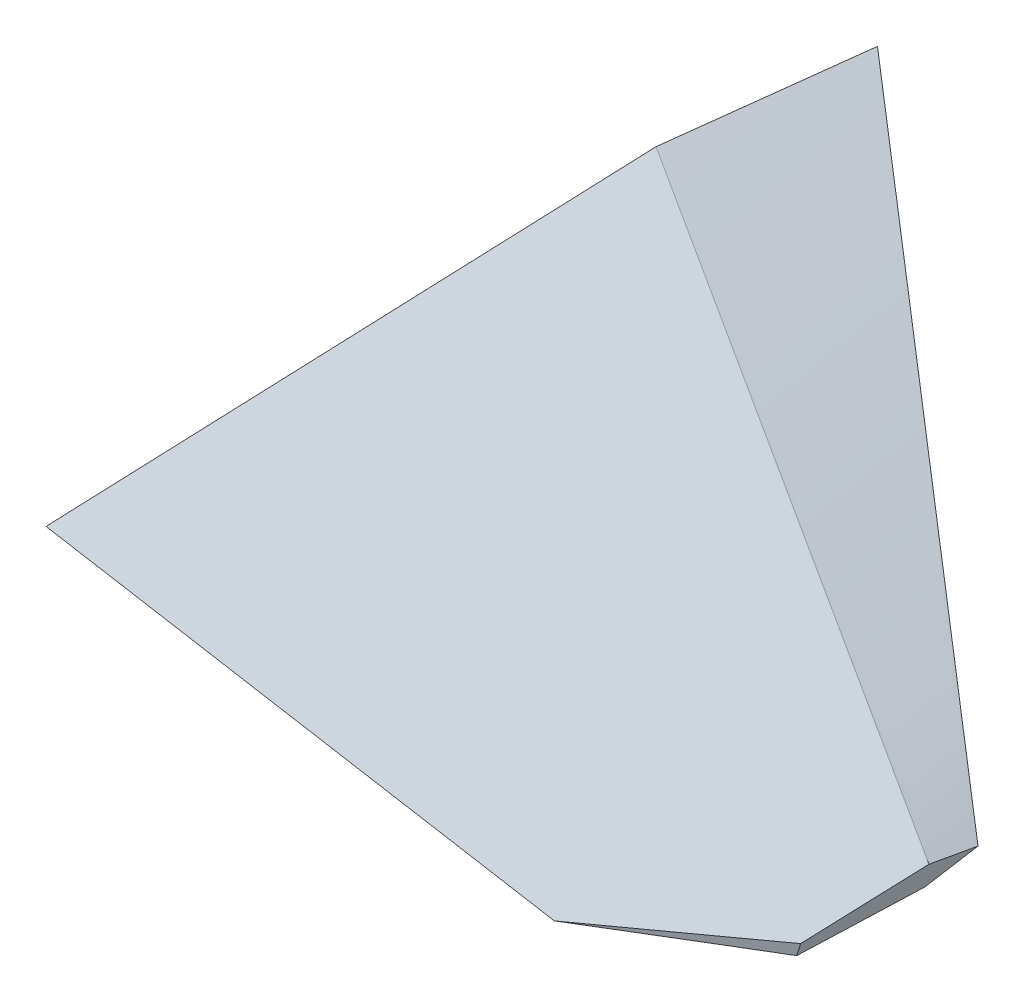
ISO-10303-21;
HEADER;
FILE_DESCRIPTION(('STEP AP214'),'2;1');
FILE_NAME('part.step','',(''),(''),'','','');
FILE_SCHEMA(('AUTOMOTIVE_DESIGN { 1 0 10303 214 1 1 1 1 }'));
ENDSEC;
DATA;
#1=APPLICATION_CONTEXT('core data for automotive mechanical design processes');
#2=APPLICATION_PROTOCOL_DEFINITION('international standard','automotive_design',2000,#1);
#3=PRODUCT_CONTEXT('',#1,'mechanical');
#4=PRODUCT('Part','Part','',(#3));
#5=PRODUCT_RELATED_PRODUCT_CATEGORY('part','',(#4));
#6=PRODUCT_DEFINITION_FORMATION('','',#4);
#7=PRODUCT_DEFINITION_CONTEXT('part definition',#1,'design');
#8=PRODUCT_DEFINITION('design','',#6,#7);
#9=PRODUCT_DEFINITION_SHAPE('','',#8);
#10=(LENGTH_UNIT() NAMED_UNIT(*) SI_UNIT(.MILLI.,.METRE.));
#11=(NAMED_UNIT(*) PLANE_ANGLE_UNIT() SI_UNIT($,.RADIAN.));
#12=(NAMED_UNIT(*) SI_UNIT($,.STERADIAN.) SOLID_ANGLE_UNIT());
#13=UNCERTAINTY_MEASURE_WITH_UNIT(LENGTH_MEASURE(1.E-05),#10,'distance_accuracy_value','');
#14=(GEOMETRIC_REPRESENTATION_CONTEXT(3) GLOBAL_UNCERTAINTY_ASSIGNED_CONTEXT((#13)) GLOBAL_UNIT_ASSIGNED_CONTEXT((#10,
#11,#12)) REPRESENTATION_CONTEXT('',''));
#15=CARTESIAN_POINT('',(0.,0.,0.));
#16=DIRECTION('',(0.,0.,1.));
#17=DIRECTION('',(1.,0.,0.));
#18=AXIS2_PLACEMENT_3D('',#15,#16,#17);
#19=CARTESIAN_POINT('',(2264.,0.,7652.5));
#20=DIRECTION('',(-0.697531016860244,0.,-0.716554590047342));
#21=DIRECTION('',(0.716554590047342,0.,-0.697531016860244));
#22=AXIS2_PLACEMENT_3D('',#19,#20,#21);
#23=PLANE('',#22);
#24=DIRECTION('',(-0.181855240179557,-0.967259031099984,0.177027224953551));
#25=VECTOR('',#24,1.);
#26=CARTESIAN_POINT('',(2777.18459449673,786.986197849038,7152.93977526867));
#27=LINE('',#26,#25);
#28=CARTESIAN_POINT('',(2917.91105544952,1535.48780900373,7015.94941504916));
#29=VERTEX_POINT('',#28);
#30=CARTESIAN_POINT('',(2912.13388329117,1504.75995129195,7021.57321095549));
#31=VERTEX_POINT('',#30);
#32=EDGE_CURVE('E211',#29,#31,#27,.T.);
#33=ORIENTED_EDGE('',*,*,#32,.F.);
#34=CARTESIAN_POINT('',(2551.68799055691,1588.30646313811,7372.44974370566));
#35=CARTESIAN_POINT('',(2561.85908933415,1586.81545891525,7362.5486740995));
#36=CARTESIAN_POINT('',(2572.03030381676,1585.32599148495,7352.64749185979));
#37=CARTESIAN_POINT('',(2592.37297369507,1582.35032101549,7332.8448928632));
#38=CARTESIAN_POINT('',(2602.54442909067,1580.86411797496,7322.94347610643));
#39=CARTESIAN_POINT('',(2622.88759502421,1577.89516639539,7303.14039422422));
#40=CARTESIAN_POINT('',(2633.05930556207,1576.41241785509,7293.23872909888));
#41=CARTESIAN_POINT('',(2653.40299741478,1573.45058449897,7273.43513525995));
#42=CARTESIAN_POINT('',(2663.57497872956,1571.97149968204,7263.53320654645));
#43=CARTESIAN_POINT('',(2683.91922896556,1569.01721889018,7243.72906914857));
#44=CARTESIAN_POINT('',(2694.09149788671,1567.54202291435,7233.82686046426));
#45=CARTESIAN_POINT('',(2714.43634157628,1564.59576382112,7214.02214536823));
#46=CARTESIAN_POINT('',(2724.60891634464,1563.12470070312,7204.11963895654));
#47=CARTESIAN_POINT('',(2744.95439375768,1560.18697149333,7184.31430696155));
#48=CARTESIAN_POINT('',(2755.1272964024,1558.72030540233,7174.41148137819));
#49=CARTESIAN_POINT('',(2775.47344849196,1555.79165792881,7154.60549261845));
#50=CARTESIAN_POINT('',(2785.64669793681,1554.32967654654,7144.70232944205));
#51=CARTESIAN_POINT('',(2805.99356655332,1551.41071086214,7124.89564317818));
#52=CARTESIAN_POINT('',(2816.16718572505,1549.9537265608,7114.99212009066));
#53=CARTESIAN_POINT('',(2836.51481882396,1547.04509614959,7095.18468964039));
#54=CARTESIAN_POINT('',(2846.68883275126,1545.59345004123,7085.28078227754));
#55=CARTESIAN_POINT('',(2867.03728250197,1542.69586548015,7065.47255685649));
#56=CARTESIAN_POINT('',(2877.21171832558,1541.24992702993,7055.56823879811));
#57=CARTESIAN_POINT('',(2897.56104221048,1538.36417238011,7035.75916244998));
#58=CARTESIAN_POINT('',(2907.73593027205,1536.92435618436,7025.85440415995));
#59=CARTESIAN_POINT('',(2917.91105544952,1535.48780900373,7015.94941504914));
#60=B_SPLINE_CURVE_WITH_KNOTS('',3,(#34,#35,#36,#37,#38,#39,#40,#41,#42,#43,#44,#45,#46,#47,#48,
#49,#50,#51,#52,#53,#54,#55,#56,#57,#58,#59),.UNSPECIFIED.,.F.,.F.,(4,2,2,2,2,2,2,2,2,2,2,2,4),
(0.,42.8176331472219,85.6352485668465,128.452848431335,171.270435344161,214.088012415988,
256.905583355069,299.723162072028,342.54074306137,385.358330773943,428.175930671245,
470.993549428293,513.81119517947),.UNSPECIFIED.);
#61=CARTESIAN_POINT('',(2551.68799055691,1588.30646313811,7372.44974370566));
#62=VERTEX_POINT('',#61);
#63=EDGE_CURVE('E50',#62,#29,#60,.T.);
#64=ORIENTED_EDGE('',*,*,#63,.F.);
#65=CARTESIAN_POINT('',(2912.13388329117,1504.75995129195,7021.5732109555));
#66=CARTESIAN_POINT('',(2902.12505219001,1507.11050301799,7031.31632087699));
#67=CARTESIAN_POINT('',(2892.11583480539,1509.45785003662,7041.05980682661));
#68=CARTESIAN_POINT('',(2872.09668602345,1514.14655406342,7060.54747378248));
#69=CARTESIAN_POINT('',(2862.08675462657,1516.48791107528,7070.29165478829));
#70=CARTESIAN_POINT('',(2842.0662283264,1521.16505638709,7089.78066269111));
#71=CARTESIAN_POINT('',(2832.0556334234,1523.50084468943,7099.52548958784));
#72=CARTESIAN_POINT('',(2812.03382465856,1528.16722504834,7119.0157459076));
#73=CARTESIAN_POINT('',(2802.0226107969,1530.49781710633,7128.76117533046));
#74=CARTESIAN_POINT('',(2781.99960507437,1535.15414719082,7148.25259683026));
#75=CARTESIAN_POINT('',(2771.98781321359,1537.47988521806,7157.99858890712));
#76=CARTESIAN_POINT('',(2751.96368880111,1542.12681900675,7177.49109939715));
#77=CARTESIAN_POINT('',(2741.95135624944,1544.44801476844,7187.23761781028));
#78=CARTESIAN_POINT('',(2721.92618674402,1549.08614906913,7206.73114564742));
#79=CARTESIAN_POINT('',(2711.91334979036,1551.40308760891,7216.47815507133));
#80=CARTESIAN_POINT('',(2691.8872002493,1556.03296983426,7235.97263692547));
#81=CARTESIAN_POINT('',(2681.87388766183,1558.34591351929,7245.72010935575));
#82=CARTESIAN_POINT('',(2661.84681532834,1562.96804671853,7265.21548950339));
#83=CARTESIAN_POINT('',(2651.83305558223,1565.2772362319,7274.96339722084));
#84=CARTESIAN_POINT('',(2631.80511511008,1569.89208237054,7294.45962245921));
#85=CARTESIAN_POINT('',(2621.79093438393,1572.19773899477,7304.20793998025));
#86=CARTESIAN_POINT('',(2601.76217621634,1576.80572440556,7323.70496120533));
#87=CARTESIAN_POINT('',(2591.74759877477,1579.10805319095,7333.45366490952));
#88=CARTESIAN_POINT('',(2571.71806912773,1583.70956861293,7352.9514371323));
#89=CARTESIAN_POINT('',(2561.70311692212,1586.00875524826,7362.70050565103));
#90=CARTESIAN_POINT('',(2551.68799055691,1588.30646313811,7372.44974370566));
#91=B_SPLINE_CURVE_WITH_KNOTS('',3,(#65,#66,#67,#68,#69,#70,#71,#72,#73,#74,#75,#76,#77,#78,#79,
#80,#81,#82,#83,#84,#85,#86,#87,#88,#89,#90),.UNSPECIFIED.,.F.,.F.,(4,2,2,2,2,2,2,2,2,2,2,2,4),
(0.,42.4931735957222,84.9863210033463,127.4794502047,169.972567701935,212.465678779138,
254.958787715266,297.451888973896,339.944996179659,382.438112883539,424.931242053921,
467.424386167427,509.917547284836),.UNSPECIFIED.);
#92=EDGE_CURVE('E11',#31,#62,#91,.T.);
#93=ORIENTED_EDGE('',*,*,#92,.F.);
#94=EDGE_LOOP('',(#33,#64,#93));
#95=FACE_BOUND('',#94,.T.);
#96=ADVANCED_FACE('F41',(#95),#23,.F.);
#97=CARTESIAN_POINT('',(2539.45761462919,-477.445709562425,-7.03929742032787E-13));
#98=DIRECTION('',(0.982781120457582,-0.184773562156871,0.));
#99=DIRECTION('',(0.184773562156871,0.982781120457582,0.));
#100=AXIS2_PLACEMENT_3D('',#97,#98,#99);
#101=PLANE('',#100);
#102=ORIENTED_EDGE('',*,*,#32,.T.);
#103=CARTESIAN_POINT('',(2908.99403778226,1488.05961358513,6642.5));
#104=CARTESIAN_POINT('',(2909.99489457728,1493.38301132094,6763.33333333332));
#105=CARTESIAN_POINT('',(2910.99575137229,1498.70640905675,6884.16666666665));
#106=CARTESIAN_POINT('',(2912.99746496233,1509.35320452838,7125.83333333332));
#107=CARTESIAN_POINT('',(2913.99832175734,1514.67660226419,7246.66666666666));
#108=CARTESIAN_POINT('',(2914.99917855236,1520.,7367.5));
#109=B_SPLINE_CURVE_WITH_KNOTS('',3,(#103,#104,#105,#106,#107,#108),.UNSPECIFIED.,.F.,.F.,(4,2,
4),(0.,0.5,1.),.UNSPECIFIED.);
#110=CARTESIAN_POINT('',(2908.99403778226,1488.05961358513,6642.5));
#111=VERTEX_POINT('',#110);
#112=EDGE_CURVE('E63',#111,#31,#109,.T.);
#113=ORIENTED_EDGE('',*,*,#112,.F.);
#114=CARTESIAN_POINT('',(2914.99917855236,1520.,6492.5));
#115=CARTESIAN_POINT('',(2913.99832175734,1514.67660226419,6517.5));
#116=CARTESIAN_POINT('',(2912.99746496233,1509.35320452838,6542.5));
#117=CARTESIAN_POINT('',(2910.99575137229,1498.70640905675,6592.5));
#118=CARTESIAN_POINT('',(2909.99489457728,1493.38301132094,6617.5));
#119=CARTESIAN_POINT('',(2908.99403778226,1488.05961358513,6642.5));
#120=B_SPLINE_CURVE_WITH_KNOTS('',3,(#114,#115,#116,#117,#118,#119),.UNSPECIFIED.,.F.,.F.,(4,2,
4),(0.,0.5,1.),.UNSPECIFIED.);
#121=CARTESIAN_POINT('',(2914.99917855236,1520.,6492.5));
#122=VERTEX_POINT('',#121);
#123=EDGE_CURVE('E216',#122,#111,#120,.T.);
#124=ORIENTED_EDGE('',*,*,#123,.F.);
#125=CARTESIAN_POINT('',(2921.00431932246,1551.94038641487,6642.5));
#126=CARTESIAN_POINT('',(2920.00346252744,1546.61698867906,6617.49999999999));
#127=CARTESIAN_POINT('',(2919.00260573242,1541.29359094325,6592.49999999999));
#128=CARTESIAN_POINT('',(2917.00089214239,1530.64679547162,6542.49999999999));
#129=CARTESIAN_POINT('',(2916.00003534738,1525.32339773581,6517.49999999999));
#130=CARTESIAN_POINT('',(2914.99917855236,1520.,6492.5));
#131=B_SPLINE_CURVE_WITH_KNOTS('',3,(#125,#126,#127,#128,#129,#130),.UNSPECIFIED.,.F.,.F.,(4,2,
4),(0.,0.5,1.),.UNSPECIFIED.);
#132=CARTESIAN_POINT('',(2921.00431932246,1551.94038641487,6642.5));
#133=VERTEX_POINT('',#132);
#134=EDGE_CURVE('E97',#133,#122,#131,.T.);
#135=ORIENTED_EDGE('',*,*,#134,.F.);
#136=CARTESIAN_POINT('',(2914.99917855236,1520.,7367.5));
#137=CARTESIAN_POINT('',(2916.00003534738,1525.32339773581,7246.66666666669));
#138=CARTESIAN_POINT('',(2917.00089214239,1530.64679547162,7125.83333333337));
#139=CARTESIAN_POINT('',(2919.00260573242,1541.29359094325,6884.16666666671));
#140=CARTESIAN_POINT('',(2920.00346252744,1546.61698867906,6763.33333333336));
#141=CARTESIAN_POINT('',(2921.00431932246,1551.94038641487,6642.5));
#142=B_SPLINE_CURVE_WITH_KNOTS('',3,(#136,#137,#138,#139,#140,#141),.UNSPECIFIED.,.F.,.F.,(4,2,
4),(0.,0.5,1.),.UNSPECIFIED.);
#143=EDGE_CURVE('E215',#29,#133,#142,.T.);
#144=ORIENTED_EDGE('',*,*,#143,.F.);
#145=EDGE_LOOP('',(#102,#113,#124,#135,#144));
#146=FACE_BOUND('',#145,.T.);
#147=ADVANCED_FACE('F144',(#146),#101,.T.);
#148=CARTESIAN_POINT('',(1079.99917855236,0.,0.));
#149=DIRECTION('',(1.,0.,0.));
#150=DIRECTION('',(0.,0.,1.));
#151=AXIS2_PLACEMENT_3D('',#148,#149,#150);
#152=PLANE('',#151);
#153=CARTESIAN_POINT('',(1079.99917855236,1795.,5602.5));
#154=CARTESIAN_POINT('',(1079.99917855236,1806.66666666667,5494.16666666666));
#155=CARTESIAN_POINT('',(1079.99917855236,1818.33333333333,5385.83333333332));
#156=CARTESIAN_POINT('',(1079.99917855236,1841.66666666667,5169.16666666665));
#157=CARTESIAN_POINT('',(1079.99917855236,1853.33333333333,5060.83333333332));
#158=CARTESIAN_POINT('',(1079.99917855236,1865.,4952.5));
#159=B_SPLINE_CURVE_WITH_KNOTS('',3,(#153,#154,#155,#156,#157,#158),.UNSPECIFIED.,.F.,.F.,(4,2,
4),(0.,0.5,1.),.UNSPECIFIED.);
#160=CARTESIAN_POINT('',(1079.99917855236,1865.,4952.5));
#161=VERTEX_POINT('',#160);
#162=CARTESIAN_POINT('',(1079.99917855236,1795.,5602.5));
#163=VERTEX_POINT('',#162);
#164=EDGE_CURVE('E111',#161,#163,#159,.F.);
#165=ORIENTED_EDGE('',*,*,#164,.T.);
#166=CARTESIAN_POINT('',(1079.99917855236,1865.,7392.5));
#167=CARTESIAN_POINT('',(1079.99917855236,1853.33333333333,7094.16666666666));
#168=CARTESIAN_POINT('',(1079.99917855236,1841.66666666667,6795.83333333332));
#169=CARTESIAN_POINT('',(1079.99917855236,1818.33333333333,6199.16666666666));
#170=CARTESIAN_POINT('',(1079.99917855236,1806.66666666667,5900.83333333333));
#171=CARTESIAN_POINT('',(1079.99917855236,1795.,5602.5));
#172=B_SPLINE_CURVE_WITH_KNOTS('',3,(#166,#167,#168,#169,#170,#171),.UNSPECIFIED.,.F.,.F.,(4,2,
4),(0.,0.5,1.),.UNSPECIFIED.);
#173=CARTESIAN_POINT('',(1079.99917855236,1865.,7392.5));
#174=VERTEX_POINT('',#173);
#175=EDGE_CURVE('E120',#163,#174,#172,.F.);
#176=ORIENTED_EDGE('',*,*,#175,.T.);
#177=CARTESIAN_POINT('',(1079.99917855236,1935.,5602.5));
#178=CARTESIAN_POINT('',(1079.99917855236,1923.33333333333,5900.83333333334));
#179=CARTESIAN_POINT('',(1079.99917855236,1911.66666666667,6199.16666666667));
#180=CARTESIAN_POINT('',(1079.99917855236,1888.33333333333,6795.83333333334));
#181=CARTESIAN_POINT('',(1079.99917855236,1876.66666666667,7094.16666666667));
#182=CARTESIAN_POINT('',(1079.99917855236,1865.,7392.5));
#183=B_SPLINE_CURVE_WITH_KNOTS('',3,(#177,#178,#179,#180,#181,#182),.UNSPECIFIED.,.F.,.F.,(4,2,
4),(0.,0.5,1.),.UNSPECIFIED.);
#184=CARTESIAN_POINT('',(1079.99917855236,1935.,5602.5));
#185=VERTEX_POINT('',#184);
#186=EDGE_CURVE('E113',#174,#185,#183,.F.);
#187=ORIENTED_EDGE('',*,*,#186,.T.);
#188=CARTESIAN_POINT('',(1079.99917855236,1865.,4952.5));
#189=CARTESIAN_POINT('',(1079.99917855236,1876.66666666667,5060.83333333333));
#190=CARTESIAN_POINT('',(1079.99917855236,1888.33333333333,5169.16666666666));
#191=CARTESIAN_POINT('',(1079.99917855236,1911.66666666667,5385.83333333333));
#192=CARTESIAN_POINT('',(1079.99917855236,1923.33333333333,5494.16666666666));
#193=CARTESIAN_POINT('',(1079.99917855236,1935.,5602.5));
#194=B_SPLINE_CURVE_WITH_KNOTS('',3,(#188,#189,#190,#191,#192,#193),.UNSPECIFIED.,.F.,.F.,(4,2,
4),(0.,0.5,1.),.UNSPECIFIED.);
#195=EDGE_CURVE('E93',#185,#161,#194,.F.);
#196=ORIENTED_EDGE('',*,*,#195,.T.);
#197=EDGE_LOOP('',(#165,#176,#187,#196));
#198=FACE_BOUND('',#197,.T.);
#199=ADVANCED_FACE('F109',(#198),#152,.F.);
#200=CARTESIAN_POINT('',(1079.99917855236,1865.,7392.5));
#201=CARTESIAN_POINT('',(2914.99917855236,1520.,7367.5));
#202=CARTESIAN_POINT('',(1079.99917855236,1876.66666666667,7094.16666666667));
#203=CARTESIAN_POINT('',(2916.00003534738,1525.32339773581,7246.66666666669));
#204=CARTESIAN_POINT('',(1079.99917855236,1888.33333333333,6795.83333333334));
#205=CARTESIAN_POINT('',(2917.00089214239,1530.64679547162,7125.83333333337));
#206=CARTESIAN_POINT('',(1079.99917855236,1911.66666666667,6199.16666666667));
#207=CARTESIAN_POINT('',(2919.00260573242,1541.29359094325,6884.16666666671));
#208=CARTESIAN_POINT('',(1079.99917855236,1923.33333333333,5900.83333333334));
#209=CARTESIAN_POINT('',(2920.00346252744,1546.61698867906,6763.33333333336));
#210=CARTESIAN_POINT('',(1079.99917855236,1935.,5602.5));
#211=CARTESIAN_POINT('',(2921.00431932246,1551.94038641487,6642.5));
#212=B_SPLINE_SURFACE_WITH_KNOTS('',3,1,((#200,#201),(#202,#203),(#204,#205),(#206,#207),(#208,
#209),(#210,#211)),.UNSPECIFIED.,.F.,.F.,.F.,(4,2,4),(2,2),(0.,0.5,1.),(0.,1.),.UNSPECIFIED.);
#213=DIRECTION('',(0.856732455634059,-0.178261101032962,0.483975701168718));
#214=VECTOR('',#213,1.);
#215=CARTESIAN_POINT('',(2000.50174893741,1743.47019320744,6122.5));
#216=LINE('',#215,#214);
#217=EDGE_CURVE('E104',#185,#133,#216,.T.);
#218=DIRECTION('',(-0.982693037901236,0.184757001676254,0.0133881885272636));
#219=VECTOR('',#218,1.);
#220=CARTESIAN_POINT('',(1997.49917855236,1692.5,7380.));
#221=LINE('',#220,#219);
#222=EDGE_CURVE('E57',#62,#174,#221,.T.);
#223=ORIENTED_EDGE('',*,*,#63,.T.);
#224=ORIENTED_EDGE('',*,*,#143,.T.);
#225=ORIENTED_EDGE('',*,*,#217,.F.);
#226=ORIENTED_EDGE('',*,*,#186,.F.);
#227=ORIENTED_EDGE('',*,*,#222,.F.);
#228=EDGE_LOOP('',(#223,#224,#225,#226,#227));
#229=FACE_BOUND('',#228,.T.);
#230=ADVANCED_FACE('F174',(#229),#212,.F.);
#231=CARTESIAN_POINT('',(1079.99917855236,1935.,5602.5));
#232=CARTESIAN_POINT('',(2921.00431932246,1551.94038641487,6642.5));
#233=CARTESIAN_POINT('',(1079.99917855236,1923.33333333333,5494.16666666666));
#234=CARTESIAN_POINT('',(2920.00346252744,1546.61698867906,6617.49999999999));
#235=CARTESIAN_POINT('',(1079.99917855236,1911.66666666667,5385.83333333333));
#236=CARTESIAN_POINT('',(2919.00260573242,1541.29359094325,6592.49999999999));
#237=CARTESIAN_POINT('',(1079.99917855236,1888.33333333333,5169.16666666666));
#238=CARTESIAN_POINT('',(2917.00089214239,1530.64679547162,6542.49999999999));
#239=CARTESIAN_POINT('',(1079.99917855236,1876.66666666667,5060.83333333333));
#240=CARTESIAN_POINT('',(2916.00003534738,1525.32339773581,6517.49999999999));
#241=CARTESIAN_POINT('',(1079.99917855236,1865.,4952.5));
#242=CARTESIAN_POINT('',(2914.99917855236,1520.,6492.5));
#243=B_SPLINE_SURFACE_WITH_KNOTS('',3,1,((#231,#232),(#233,#234),(#235,#236),(#237,#238),(#239,
#240),(#241,#242)),.UNSPECIFIED.,.F.,.F.,.F.,(4,2,4),(2,2),(0.,0.5,1.),(0.,1.),.UNSPECIFIED.);
#244=DIRECTION('',(0.758170609986903,-0.142544338117429,0.636284871596639));
#245=VECTOR('',#244,1.);
#246=CARTESIAN_POINT('',(1997.49917855236,1692.5,5722.5));
#247=LINE('',#246,#245);
#248=EDGE_CURVE('E90',#161,#122,#247,.T.);
#249=ORIENTED_EDGE('',*,*,#195,.F.);
#250=ORIENTED_EDGE('',*,*,#217,.T.);
#251=ORIENTED_EDGE('',*,*,#134,.T.);
#252=ORIENTED_EDGE('',*,*,#248,.F.);
#253=EDGE_LOOP('',(#249,#250,#251,#252));
#254=FACE_BOUND('',#253,.T.);
#255=ADVANCED_FACE('F92',(#254),#243,.F.);
#256=CARTESIAN_POINT('',(1079.99917855236,1795.,5602.5));
#257=CARTESIAN_POINT('',(2908.99403778226,1488.05961358513,6642.5));
#258=CARTESIAN_POINT('',(1079.99917855236,1806.66666666667,5900.83333333333));
#259=CARTESIAN_POINT('',(2909.99489457728,1493.38301132094,6763.33333333332));
#260=CARTESIAN_POINT('',(1079.99917855236,1818.33333333333,6199.16666666666));
#261=CARTESIAN_POINT('',(2910.99575137229,1498.70640905675,6884.16666666665));
#262=CARTESIAN_POINT('',(1079.99917855236,1841.66666666667,6795.83333333332));
#263=CARTESIAN_POINT('',(2912.99746496233,1509.35320452838,7125.83333333332));
#264=CARTESIAN_POINT('',(1079.99917855236,1853.33333333333,7094.16666666666));
#265=CARTESIAN_POINT('',(2913.99832175734,1514.67660226419,7246.66666666666));
#266=CARTESIAN_POINT('',(1079.99917855236,1865.,7392.5));
#267=CARTESIAN_POINT('',(2914.99917855236,1520.,7367.5));
#268=B_SPLINE_SURFACE_WITH_KNOTS('',3,1,((#256,#257),(#258,#259),(#260,#261),(#262,#263),(#264,
#265),(#266,#267)),.UNSPECIFIED.,.F.,.F.,.F.,(4,2,4),(2,2),(0.,0.5,1.),(0.,1.),.UNSPECIFIED.);
#269=DIRECTION('',(0.860188376249254,-0.144356093328056,0.489118876843588));
#270=VECTOR('',#269,1.);
#271=CARTESIAN_POINT('',(1994.49660816731,1641.52980679256,6122.5));
#272=LINE('',#271,#270);
#273=EDGE_CURVE('E103',#163,#111,#272,.T.);
#274=ORIENTED_EDGE('',*,*,#92,.T.);
#275=ORIENTED_EDGE('',*,*,#222,.T.);
#276=ORIENTED_EDGE('',*,*,#175,.F.);
#277=ORIENTED_EDGE('',*,*,#273,.T.);
#278=ORIENTED_EDGE('',*,*,#112,.T.);
#279=EDGE_LOOP('',(#274,#275,#276,#277,#278));
#280=FACE_BOUND('',#279,.T.);
#281=ADVANCED_FACE('F139',(#280),#268,.F.);
#282=CARTESIAN_POINT('',(1079.99917855236,1865.,4952.5));
#283=CARTESIAN_POINT('',(2914.99917855236,1520.,6492.5));
#284=CARTESIAN_POINT('',(1079.99917855236,1853.33333333333,5060.83333333332));
#285=CARTESIAN_POINT('',(2913.99832175734,1514.67660226419,6517.5));
#286=CARTESIAN_POINT('',(1079.99917855236,1841.66666666667,5169.16666666665));
#287=CARTESIAN_POINT('',(2912.99746496233,1509.35320452838,6542.5));
#288=CARTESIAN_POINT('',(1079.99917855236,1818.33333333333,5385.83333333332));
#289=CARTESIAN_POINT('',(2910.99575137229,1498.70640905675,6592.5));
#290=CARTESIAN_POINT('',(1079.99917855236,1806.66666666667,5494.16666666666));
#291=CARTESIAN_POINT('',(2909.99489457728,1493.38301132094,6617.5));
#292=CARTESIAN_POINT('',(1079.99917855236,1795.,5602.5));
#293=CARTESIAN_POINT('',(2908.99403778226,1488.05961358513,6642.5));
#294=B_SPLINE_SURFACE_WITH_KNOTS('',3,1,((#282,#283),(#284,#285),(#286,#287),(#288,#289),(#290,
#291),(#292,#293)),.UNSPECIFIED.,.F.,.F.,.F.,(4,2,4),(2,2),(0.,0.5,1.),(0.,1.),.UNSPECIFIED.);
#295=ORIENTED_EDGE('',*,*,#164,.F.);
#296=ORIENTED_EDGE('',*,*,#248,.T.);
#297=ORIENTED_EDGE('',*,*,#123,.T.);
#298=ORIENTED_EDGE('',*,*,#273,.F.);
#299=EDGE_LOOP('',(#295,#296,#297,#298));
#300=FACE_BOUND('',#299,.T.);
#301=ADVANCED_FACE('F118',(#300),#294,.F.);
#302=CLOSED_SHELL('',(#96,#147,#199,#230,#255,#281,#301));
#303=MANIFOLD_SOLID_BREP('B2',#302);
#304=ADVANCED_BREP_SHAPE_REPRESENTATION('',(#18,#303),#14);
#305=SHAPE_DEFINITION_REPRESENTATION(#9,#304);
ENDSEC;
END-ISO-10303-21;
